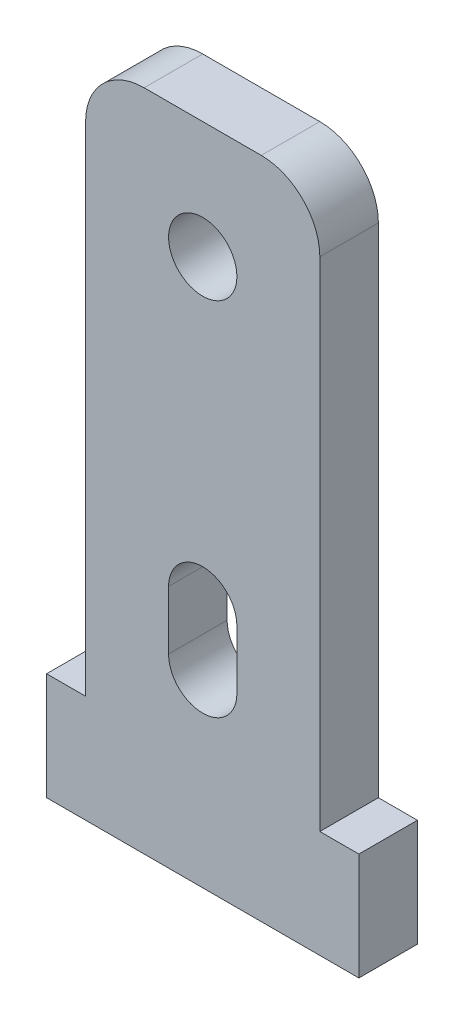
ISO-10303-21;
HEADER;
FILE_DESCRIPTION(('STEP AP214'),'2;1');
FILE_NAME('part.step','',(''),(''),'','','');
FILE_SCHEMA(('AUTOMOTIVE_DESIGN { 1 0 10303 214 1 1 1 1 }'));
ENDSEC;
DATA;
#1=APPLICATION_CONTEXT('core data for automotive mechanical design processes');
#2=APPLICATION_PROTOCOL_DEFINITION('international standard','automotive_design',2000,#1);
#3=PRODUCT_CONTEXT('',#1,'mechanical');
#4=PRODUCT('Part','Part','',(#3));
#5=PRODUCT_RELATED_PRODUCT_CATEGORY('part','',(#4));
#6=PRODUCT_DEFINITION_FORMATION('','',#4);
#7=PRODUCT_DEFINITION_CONTEXT('part definition',#1,'design');
#8=PRODUCT_DEFINITION('design','',#6,#7);
#9=PRODUCT_DEFINITION_SHAPE('','',#8);
#10=(LENGTH_UNIT() NAMED_UNIT(*) SI_UNIT(.MILLI.,.METRE.));
#11=(NAMED_UNIT(*) PLANE_ANGLE_UNIT() SI_UNIT($,.RADIAN.));
#12=(NAMED_UNIT(*) SI_UNIT($,.STERADIAN.) SOLID_ANGLE_UNIT());
#13=UNCERTAINTY_MEASURE_WITH_UNIT(LENGTH_MEASURE(1.E-05),#10,'distance_accuracy_value','');
#14=(GEOMETRIC_REPRESENTATION_CONTEXT(3) GLOBAL_UNCERTAINTY_ASSIGNED_CONTEXT((#13)) GLOBAL_UNIT_ASSIGNED_CONTEXT((#10,
#11,#12)) REPRESENTATION_CONTEXT('',''));
#15=CARTESIAN_POINT('',(0.,0.,0.));
#16=DIRECTION('',(0.,0.,1.));
#17=DIRECTION('',(1.,0.,0.));
#18=AXIS2_PLACEMENT_3D('',#15,#16,#17);
#19=CARTESIAN_POINT('',(0.,18.5,3.));
#20=DIRECTION('',(0.,1.,0.));
#21=DIRECTION('',(0.,0.,1.));
#22=AXIS2_PLACEMENT_3D('',#19,#20,#21);
#23=PLANE('',#22);
#24=DIRECTION('',(1.,0.,0.));
#25=VECTOR('',#24,1.);
#26=CARTESIAN_POINT('',(0.,18.5,0.));
#27=LINE('',#26,#25);
#28=CARTESIAN_POINT('',(-3.,18.5,0.));
#29=VERTEX_POINT('',#28);
#30=CARTESIAN_POINT('',(3.,18.5,0.));
#31=VERTEX_POINT('',#30);
#32=EDGE_CURVE('E192',#29,#31,#27,.T.);
#33=ORIENTED_EDGE('',*,*,#32,.F.);
#34=DIRECTION('',(0.,0.,-1.));
#35=VECTOR('',#34,1.);
#36=CARTESIAN_POINT('',(-3.,18.5,3.));
#37=LINE('',#36,#35);
#38=CARTESIAN_POINT('',(-3.,18.5,3.));
#39=VERTEX_POINT('',#38);
#40=EDGE_CURVE('E11',#39,#29,#37,.T.);
#41=ORIENTED_EDGE('',*,*,#40,.F.);
#42=DIRECTION('',(1.,0.,0.));
#43=VECTOR('',#42,1.);
#44=CARTESIAN_POINT('',(0.,18.5,3.));
#45=LINE('',#44,#43);
#46=CARTESIAN_POINT('',(3.,18.5,3.));
#47=VERTEX_POINT('',#46);
#48=EDGE_CURVE('E259',#39,#47,#45,.T.);
#49=ORIENTED_EDGE('',*,*,#48,.T.);
#50=DIRECTION('',(0.,0.,-1.));
#51=VECTOR('',#50,1.);
#52=CARTESIAN_POINT('',(3.,18.5,3.));
#53=LINE('',#52,#51);
#54=EDGE_CURVE('E60',#47,#31,#53,.T.);
#55=ORIENTED_EDGE('',*,*,#54,.T.);
#56=EDGE_LOOP('',(#33,#41,#49,#55));
#57=FACE_BOUND('',#56,.T.);
#58=ADVANCED_FACE('F41',(#57),#23,.T.);
#59=CARTESIAN_POINT('',(-3.,15.5,3.));
#60=DIRECTION('',(0.,0.,-1.));
#61=DIRECTION('',(-1.,0.,0.));
#62=AXIS2_PLACEMENT_3D('',#59,#60,#61);
#63=CYLINDRICAL_SURFACE('',#62,3.);
#64=CARTESIAN_POINT('',(-3.,15.5,0.));
#65=DIRECTION('',(0.,0.,1.));
#66=DIRECTION('',(1.,0.,0.));
#67=AXIS2_PLACEMENT_3D('',#64,#65,#66);
#68=CIRCLE('',#67,3.);
#69=CARTESIAN_POINT('',(-6.,15.5,0.));
#70=VERTEX_POINT('',#69);
#71=EDGE_CURVE('E194',#29,#70,#68,.T.);
#72=ORIENTED_EDGE('',*,*,#71,.T.);
#73=DIRECTION('',(0.,0.,-1.));
#74=VECTOR('',#73,1.);
#75=CARTESIAN_POINT('',(-6.,15.5,3.));
#76=LINE('',#75,#74);
#77=CARTESIAN_POINT('',(-6.,15.5,3.));
#78=VERTEX_POINT('',#77);
#79=EDGE_CURVE('E51',#78,#70,#76,.T.);
#80=ORIENTED_EDGE('',*,*,#79,.F.);
#81=CARTESIAN_POINT('',(-3.,15.5,3.));
#82=DIRECTION('',(0.,0.,1.));
#83=DIRECTION('',(1.,0.,0.));
#84=AXIS2_PLACEMENT_3D('',#81,#82,#83);
#85=CIRCLE('',#84,3.);
#86=EDGE_CURVE('E267',#39,#78,#85,.T.);
#87=ORIENTED_EDGE('',*,*,#86,.F.);
#88=ORIENTED_EDGE('',*,*,#40,.T.);
#89=EDGE_LOOP('',(#72,#80,#87,#88));
#90=FACE_BOUND('',#89,.T.);
#91=ADVANCED_FACE('F297',(#90),#63,.T.);
#92=CARTESIAN_POINT('',(-6.,0.,3.));
#93=DIRECTION('',(1.,0.,0.));
#94=DIRECTION('',(0.,1.,0.));
#95=AXIS2_PLACEMENT_3D('',#92,#93,#94);
#96=PLANE('',#95);
#97=DIRECTION('',(0.,-1.,0.));
#98=VECTOR('',#97,1.);
#99=CARTESIAN_POINT('',(-6.,0.,0.));
#100=LINE('',#99,#98);
#101=CARTESIAN_POINT('',(-5.99999999999999,-10.,0.));
#102=VERTEX_POINT('',#101);
#103=EDGE_CURVE('E197',#70,#102,#100,.T.);
#104=ORIENTED_EDGE('',*,*,#103,.T.);
#105=DIRECTION('',(0.,0.,-1.));
#106=VECTOR('',#105,1.);
#107=CARTESIAN_POINT('',(-5.99999999999999,-10.,3.));
#108=LINE('',#107,#106);
#109=CARTESIAN_POINT('',(-5.99999999999999,-10.,3.));
#110=VERTEX_POINT('',#109);
#111=EDGE_CURVE('E229',#110,#102,#108,.T.);
#112=ORIENTED_EDGE('',*,*,#111,.F.);
#113=DIRECTION('',(0.,-1.,0.));
#114=VECTOR('',#113,1.);
#115=CARTESIAN_POINT('',(-6.,0.,3.));
#116=LINE('',#115,#114);
#117=EDGE_CURVE('E270',#78,#110,#116,.T.);
#118=ORIENTED_EDGE('',*,*,#117,.F.);
#119=ORIENTED_EDGE('',*,*,#79,.T.);
#120=EDGE_LOOP('',(#104,#112,#118,#119));
#121=FACE_BOUND('',#120,.T.);
#122=ADVANCED_FACE('F302',(#121),#96,.F.);
#123=CARTESIAN_POINT('',(0.,-10.,3.));
#124=DIRECTION('',(0.,1.,0.));
#125=DIRECTION('',(-1.,0.,0.));
#126=AXIS2_PLACEMENT_3D('',#123,#124,#125);
#127=PLANE('',#126);
#128=DIRECTION('',(1.,0.,0.));
#129=VECTOR('',#128,1.);
#130=CARTESIAN_POINT('',(0.,-10.,0.));
#131=LINE('',#130,#129);
#132=CARTESIAN_POINT('',(-8.,-10.,0.));
#133=VERTEX_POINT('',#132);
#134=EDGE_CURVE('E200',#133,#102,#131,.T.);
#135=ORIENTED_EDGE('',*,*,#134,.F.);
#136=DIRECTION('',(0.,0.,-1.));
#137=VECTOR('',#136,1.);
#138=CARTESIAN_POINT('',(-8.,-10.,3.));
#139=LINE('',#138,#137);
#140=CARTESIAN_POINT('',(-8.,-10.,3.));
#141=VERTEX_POINT('',#140);
#142=EDGE_CURVE('E227',#141,#133,#139,.T.);
#143=ORIENTED_EDGE('',*,*,#142,.F.);
#144=DIRECTION('',(1.,0.,0.));
#145=VECTOR('',#144,1.);
#146=CARTESIAN_POINT('',(0.,-10.,3.));
#147=LINE('',#146,#145);
#148=EDGE_CURVE('E272',#141,#110,#147,.T.);
#149=ORIENTED_EDGE('',*,*,#148,.T.);
#150=ORIENTED_EDGE('',*,*,#111,.T.);
#151=EDGE_LOOP('',(#135,#143,#149,#150));
#152=FACE_BOUND('',#151,.T.);
#153=ADVANCED_FACE('F330',(#152),#127,.T.);
#154=CARTESIAN_POINT('',(-8.,0.,3.));
#155=DIRECTION('',(1.,0.,0.));
#156=DIRECTION('',(0.,0.,-1.));
#157=AXIS2_PLACEMENT_3D('',#154,#155,#156);
#158=PLANE('',#157);
#159=DIRECTION('',(0.,-1.,0.));
#160=VECTOR('',#159,1.);
#161=CARTESIAN_POINT('',(-8.,0.,0.));
#162=LINE('',#161,#160);
#163=CARTESIAN_POINT('',(-8.,-15.5,0.));
#164=VERTEX_POINT('',#163);
#165=EDGE_CURVE('E203',#133,#164,#162,.T.);
#166=ORIENTED_EDGE('',*,*,#165,.T.);
#167=DIRECTION('',(0.,0.,-1.));
#168=VECTOR('',#167,1.);
#169=CARTESIAN_POINT('',(-8.,-15.5,3.));
#170=LINE('',#169,#168);
#171=CARTESIAN_POINT('',(-8.,-15.5,3.));
#172=VERTEX_POINT('',#171);
#173=EDGE_CURVE('E224',#172,#164,#170,.T.);
#174=ORIENTED_EDGE('',*,*,#173,.F.);
#175=DIRECTION('',(0.,-1.,0.));
#176=VECTOR('',#175,1.);
#177=CARTESIAN_POINT('',(-8.,0.,3.));
#178=LINE('',#177,#176);
#179=EDGE_CURVE('E275',#141,#172,#178,.T.);
#180=ORIENTED_EDGE('',*,*,#179,.F.);
#181=ORIENTED_EDGE('',*,*,#142,.T.);
#182=EDGE_LOOP('',(#166,#174,#180,#181));
#183=FACE_BOUND('',#182,.T.);
#184=ADVANCED_FACE('F326',(#183),#158,.F.);
#185=CARTESIAN_POINT('',(0.,-15.5,3.));
#186=DIRECTION('',(0.,1.,0.));
#187=DIRECTION('',(-1.,0.,0.));
#188=AXIS2_PLACEMENT_3D('',#185,#186,#187);
#189=PLANE('',#188);
#190=DIRECTION('',(1.,0.,0.));
#191=VECTOR('',#190,1.);
#192=CARTESIAN_POINT('',(0.,-15.5,0.));
#193=LINE('',#192,#191);
#194=CARTESIAN_POINT('',(8.,-15.5,0.));
#195=VERTEX_POINT('',#194);
#196=EDGE_CURVE('E206',#164,#195,#193,.T.);
#197=ORIENTED_EDGE('',*,*,#196,.T.);
#198=DIRECTION('',(0.,0.,-1.));
#199=VECTOR('',#198,1.);
#200=CARTESIAN_POINT('',(8.,-15.5,3.));
#201=LINE('',#200,#199);
#202=CARTESIAN_POINT('',(8.,-15.5,3.));
#203=VERTEX_POINT('',#202);
#204=EDGE_CURVE('E222',#203,#195,#201,.T.);
#205=ORIENTED_EDGE('',*,*,#204,.F.);
#206=DIRECTION('',(1.,0.,0.));
#207=VECTOR('',#206,1.);
#208=CARTESIAN_POINT('',(0.,-15.5,3.));
#209=LINE('',#208,#207);
#210=EDGE_CURVE('E278',#172,#203,#209,.T.);
#211=ORIENTED_EDGE('',*,*,#210,.F.);
#212=ORIENTED_EDGE('',*,*,#173,.T.);
#213=EDGE_LOOP('',(#197,#205,#211,#212));
#214=FACE_BOUND('',#213,.T.);
#215=ADVANCED_FACE('F323',(#214),#189,.F.);
#216=CARTESIAN_POINT('',(7.99999999999999,0.,3.));
#217=DIRECTION('',(1.,0.,0.));
#218=DIRECTION('',(0.,1.,0.));
#219=AXIS2_PLACEMENT_3D('',#216,#217,#218);
#220=PLANE('',#219);
#221=DIRECTION('',(0.,-1.,0.));
#222=VECTOR('',#221,1.);
#223=CARTESIAN_POINT('',(7.99999999999999,0.,0.));
#224=LINE('',#223,#222);
#225=CARTESIAN_POINT('',(8.,-10.,0.));
#226=VERTEX_POINT('',#225);
#227=EDGE_CURVE('E209',#226,#195,#224,.T.);
#228=ORIENTED_EDGE('',*,*,#227,.F.);
#229=DIRECTION('',(0.,0.,-1.));
#230=VECTOR('',#229,1.);
#231=CARTESIAN_POINT('',(8.,-10.,3.));
#232=LINE('',#231,#230);
#233=CARTESIAN_POINT('',(8.,-10.,3.));
#234=VERTEX_POINT('',#233);
#235=EDGE_CURVE('E158',#234,#226,#232,.T.);
#236=ORIENTED_EDGE('',*,*,#235,.F.);
#237=DIRECTION('',(0.,-1.,0.));
#238=VECTOR('',#237,1.);
#239=CARTESIAN_POINT('',(7.99999999999999,0.,3.));
#240=LINE('',#239,#238);
#241=EDGE_CURVE('E168',#234,#203,#240,.T.);
#242=ORIENTED_EDGE('',*,*,#241,.T.);
#243=ORIENTED_EDGE('',*,*,#204,.T.);
#244=EDGE_LOOP('',(#228,#236,#242,#243));
#245=FACE_BOUND('',#244,.T.);
#246=ADVANCED_FACE('F281',(#245),#220,.T.);
#247=CARTESIAN_POINT('',(0.,-10.,3.));
#248=DIRECTION('',(0.,1.,0.));
#249=DIRECTION('',(-1.,0.,0.));
#250=AXIS2_PLACEMENT_3D('',#247,#248,#249);
#251=PLANE('',#250);
#252=DIRECTION('',(1.,0.,0.));
#253=VECTOR('',#252,1.);
#254=CARTESIAN_POINT('',(0.,-10.,0.));
#255=LINE('',#254,#253);
#256=CARTESIAN_POINT('',(6.,-10.,0.));
#257=VERTEX_POINT('',#256);
#258=EDGE_CURVE('E154',#257,#226,#255,.T.);
#259=ORIENTED_EDGE('',*,*,#258,.F.);
#260=DIRECTION('',(0.,0.,-1.));
#261=VECTOR('',#260,1.);
#262=CARTESIAN_POINT('',(6.,-10.,3.));
#263=LINE('',#262,#261);
#264=CARTESIAN_POINT('',(6.,-10.,3.));
#265=VERTEX_POINT('',#264);
#266=EDGE_CURVE('E149',#265,#257,#263,.T.);
#267=ORIENTED_EDGE('',*,*,#266,.F.);
#268=DIRECTION('',(1.,0.,0.));
#269=VECTOR('',#268,1.);
#270=CARTESIAN_POINT('',(0.,-10.,3.));
#271=LINE('',#270,#269);
#272=EDGE_CURVE('E152',#265,#234,#271,.T.);
#273=ORIENTED_EDGE('',*,*,#272,.T.);
#274=ORIENTED_EDGE('',*,*,#235,.T.);
#275=EDGE_LOOP('',(#259,#267,#273,#274));
#276=FACE_BOUND('',#275,.T.);
#277=ADVANCED_FACE('F151',(#276),#251,.T.);
#278=CARTESIAN_POINT('',(6.,0.,3.));
#279=DIRECTION('',(1.,0.,0.));
#280=DIRECTION('',(0.,0.,-1.));
#281=AXIS2_PLACEMENT_3D('',#278,#279,#280);
#282=PLANE('',#281);
#283=DIRECTION('',(0.,-1.,0.));
#284=VECTOR('',#283,1.);
#285=CARTESIAN_POINT('',(6.,0.,0.));
#286=LINE('',#285,#284);
#287=CARTESIAN_POINT('',(6.,15.5,0.));
#288=VERTEX_POINT('',#287);
#289=EDGE_CURVE('E213',#288,#257,#286,.T.);
#290=ORIENTED_EDGE('',*,*,#289,.F.);
#291=DIRECTION('',(0.,0.,-1.));
#292=VECTOR('',#291,1.);
#293=CARTESIAN_POINT('',(6.,15.5,3.));
#294=LINE('',#293,#292);
#295=CARTESIAN_POINT('',(6.,15.5,3.));
#296=VERTEX_POINT('',#295);
#297=EDGE_CURVE('E103',#296,#288,#294,.T.);
#298=ORIENTED_EDGE('',*,*,#297,.F.);
#299=DIRECTION('',(0.,-1.,0.));
#300=VECTOR('',#299,1.);
#301=CARTESIAN_POINT('',(6.,0.,3.));
#302=LINE('',#301,#300);
#303=EDGE_CURVE('E166',#296,#265,#302,.T.);
#304=ORIENTED_EDGE('',*,*,#303,.T.);
#305=ORIENTED_EDGE('',*,*,#266,.T.);
#306=EDGE_LOOP('',(#290,#298,#304,#305));
#307=FACE_BOUND('',#306,.T.);
#308=ADVANCED_FACE('F170',(#307),#282,.T.);
#309=CARTESIAN_POINT('',(0.,-6.,3.));
#310=DIRECTION('',(0.,0.,-1.));
#311=DIRECTION('',(-1.,0.,0.));
#312=AXIS2_PLACEMENT_3D('',#309,#310,#311);
#313=CYLINDRICAL_SURFACE('',#312,1.75);
#314=CARTESIAN_POINT('',(0.,-6.,0.));
#315=DIRECTION('',(0.,0.,1.));
#316=DIRECTION('',(1.,0.,0.));
#317=AXIS2_PLACEMENT_3D('',#314,#315,#316);
#318=CIRCLE('',#317,1.75);
#319=CARTESIAN_POINT('',(-1.75,-6.,0.));
#320=VERTEX_POINT('',#319);
#321=CARTESIAN_POINT('',(1.75,-6.,0.));
#322=VERTEX_POINT('',#321);
#323=EDGE_CURVE('E180',#320,#322,#318,.T.);
#324=ORIENTED_EDGE('',*,*,#323,.F.);
#325=DIRECTION('',(0.,0.,-1.));
#326=VECTOR('',#325,1.);
#327=CARTESIAN_POINT('',(-1.75,-6.,3.));
#328=LINE('',#327,#326);
#329=CARTESIAN_POINT('',(-1.75,-6.,3.));
#330=VERTEX_POINT('',#329);
#331=EDGE_CURVE('E45',#330,#320,#328,.T.);
#332=ORIENTED_EDGE('',*,*,#331,.F.);
#333=CARTESIAN_POINT('',(0.,-6.,3.));
#334=DIRECTION('',(0.,0.,1.));
#335=DIRECTION('',(1.,0.,0.));
#336=AXIS2_PLACEMENT_3D('',#333,#334,#335);
#337=CIRCLE('',#336,1.75);
#338=CARTESIAN_POINT('',(1.75,-6.,3.));
#339=VERTEX_POINT('',#338);
#340=EDGE_CURVE('E262',#330,#339,#337,.T.);
#341=ORIENTED_EDGE('',*,*,#340,.T.);
#342=DIRECTION('',(0.,0.,-1.));
#343=VECTOR('',#342,1.);
#344=CARTESIAN_POINT('',(1.75,-6.,3.));
#345=LINE('',#344,#343);
#346=EDGE_CURVE('E173',#339,#322,#345,.T.);
#347=ORIENTED_EDGE('',*,*,#346,.T.);
#348=EDGE_LOOP('',(#324,#332,#341,#347));
#349=FACE_BOUND('',#348,.T.);
#350=ADVANCED_FACE('F245',(#349),#313,.F.);
#351=CARTESIAN_POINT('',(-1.75,0.,3.));
#352=DIRECTION('',(1.,0.,0.));
#353=DIRECTION('',(0.,1.,0.));
#354=AXIS2_PLACEMENT_3D('',#351,#352,#353);
#355=PLANE('',#354);
#356=DIRECTION('',(0.,-1.,0.));
#357=VECTOR('',#356,1.);
#358=CARTESIAN_POINT('',(-1.75,0.,0.));
#359=LINE('',#358,#357);
#360=CARTESIAN_POINT('',(-1.75,-3.,0.));
#361=VERTEX_POINT('',#360);
#362=EDGE_CURVE('E183',#361,#320,#359,.T.);
#363=ORIENTED_EDGE('',*,*,#362,.F.);
#364=DIRECTION('',(0.,0.,-1.));
#365=VECTOR('',#364,1.);
#366=CARTESIAN_POINT('',(-1.75,-3.,3.));
#367=LINE('',#366,#365);
#368=CARTESIAN_POINT('',(-1.75,-3.,3.));
#369=VERTEX_POINT('',#368);
#370=EDGE_CURVE('E235',#369,#361,#367,.T.);
#371=ORIENTED_EDGE('',*,*,#370,.F.);
#372=DIRECTION('',(0.,-1.,0.));
#373=VECTOR('',#372,1.);
#374=CARTESIAN_POINT('',(-1.75,0.,3.));
#375=LINE('',#374,#373);
#376=EDGE_CURVE('E244',#369,#330,#375,.T.);
#377=ORIENTED_EDGE('',*,*,#376,.T.);
#378=ORIENTED_EDGE('',*,*,#331,.T.);
#379=EDGE_LOOP('',(#363,#371,#377,#378));
#380=FACE_BOUND('',#379,.T.);
#381=ADVANCED_FACE('F242',(#380),#355,.T.);
#382=CARTESIAN_POINT('',(0.,-3.,3.));
#383=DIRECTION('',(0.,0.,-1.));
#384=DIRECTION('',(-1.,0.,0.));
#385=AXIS2_PLACEMENT_3D('',#382,#383,#384);
#386=CYLINDRICAL_SURFACE('',#385,1.75);
#387=CARTESIAN_POINT('',(0.,-3.,0.));
#388=DIRECTION('',(0.,0.,1.));
#389=DIRECTION('',(1.,0.,0.));
#390=AXIS2_PLACEMENT_3D('',#387,#388,#389);
#391=CIRCLE('',#390,1.75);
#392=CARTESIAN_POINT('',(1.75,-3.,0.));
#393=VERTEX_POINT('',#392);
#394=EDGE_CURVE('E186',#393,#361,#391,.T.);
#395=ORIENTED_EDGE('',*,*,#394,.F.);
#396=DIRECTION('',(0.,0.,-1.));
#397=VECTOR('',#396,1.);
#398=CARTESIAN_POINT('',(1.75,-3.,3.));
#399=LINE('',#398,#397);
#400=CARTESIAN_POINT('',(1.75,-3.,3.));
#401=VERTEX_POINT('',#400);
#402=EDGE_CURVE('E234',#401,#393,#399,.T.);
#403=ORIENTED_EDGE('',*,*,#402,.F.);
#404=CARTESIAN_POINT('',(0.,-3.,3.));
#405=DIRECTION('',(0.,0.,1.));
#406=DIRECTION('',(1.,0.,0.));
#407=AXIS2_PLACEMENT_3D('',#404,#405,#406);
#408=CIRCLE('',#407,1.75);
#409=EDGE_CURVE('E254',#401,#369,#408,.T.);
#410=ORIENTED_EDGE('',*,*,#409,.T.);
#411=ORIENTED_EDGE('',*,*,#370,.T.);
#412=EDGE_LOOP('',(#395,#403,#410,#411));
#413=FACE_BOUND('',#412,.T.);
#414=ADVANCED_FACE('F251',(#413),#386,.F.);
#415=CARTESIAN_POINT('',(1.75,0.,3.));
#416=DIRECTION('',(1.,0.,0.));
#417=DIRECTION('',(0.,0.,-1.));
#418=AXIS2_PLACEMENT_3D('',#415,#416,#417);
#419=PLANE('',#418);
#420=DIRECTION('',(0.,-1.,0.));
#421=VECTOR('',#420,1.);
#422=CARTESIAN_POINT('',(1.75,0.,0.));
#423=LINE('',#422,#421);
#424=EDGE_CURVE('E189',#393,#322,#423,.T.);
#425=ORIENTED_EDGE('',*,*,#424,.T.);
#426=ORIENTED_EDGE('',*,*,#346,.F.);
#427=DIRECTION('',(0.,-1.,0.));
#428=VECTOR('',#427,1.);
#429=CARTESIAN_POINT('',(1.75,0.,3.));
#430=LINE('',#429,#428);
#431=EDGE_CURVE('E256',#401,#339,#430,.T.);
#432=ORIENTED_EDGE('',*,*,#431,.F.);
#433=ORIENTED_EDGE('',*,*,#402,.T.);
#434=EDGE_LOOP('',(#425,#426,#432,#433));
#435=FACE_BOUND('',#434,.T.);
#436=ADVANCED_FACE('F257',(#435),#419,.F.);
#437=CARTESIAN_POINT('',(0.,12.5,3.));
#438=DIRECTION('',(0.,0.,-1.));
#439=DIRECTION('',(-1.,0.,0.));
#440=AXIS2_PLACEMENT_3D('',#437,#438,#439);
#441=CYLINDRICAL_SURFACE('',#440,1.75);
#442=CARTESIAN_POINT('',(0.,12.5,3.));
#443=DIRECTION('',(0.,0.,1.));
#444=DIRECTION('',(1.,0.,0.));
#445=AXIS2_PLACEMENT_3D('',#442,#443,#444);
#446=CIRCLE('',#445,1.75);
#447=CARTESIAN_POINT('',(1.75,12.5,3.));
#448=VERTEX_POINT('',#447);
#449=EDGE_CURVE('E218',#448,#448,#446,.T.);
#450=ORIENTED_EDGE('',*,*,#449,.T.);
#451=EDGE_LOOP('',(#450));
#452=FACE_BOUND('',#451,.T.);
#453=CARTESIAN_POINT('',(0.,12.5,0.));
#454=DIRECTION('',(0.,0.,1.));
#455=DIRECTION('',(1.,0.,0.));
#456=AXIS2_PLACEMENT_3D('',#453,#454,#455);
#457=CIRCLE('',#456,1.75);
#458=CARTESIAN_POINT('',(1.75,12.5,0.));
#459=VERTEX_POINT('',#458);
#460=EDGE_CURVE('E177',#459,#459,#457,.T.);
#461=ORIENTED_EDGE('',*,*,#460,.F.);
#462=EDGE_LOOP('',(#461));
#463=FACE_BOUND('',#462,.T.);
#464=ADVANCED_FACE('F43',(#452,#463),#441,.F.);
#465=CARTESIAN_POINT('',(3.,15.5,3.));
#466=DIRECTION('',(0.,0.,-1.));
#467=DIRECTION('',(-1.,0.,0.));
#468=AXIS2_PLACEMENT_3D('',#465,#466,#467);
#469=CYLINDRICAL_SURFACE('',#468,3.);
#470=CARTESIAN_POINT('',(3.,15.5,0.));
#471=DIRECTION('',(0.,0.,1.));
#472=DIRECTION('',(1.,0.,0.));
#473=AXIS2_PLACEMENT_3D('',#470,#471,#472);
#474=CIRCLE('',#473,3.);
#475=EDGE_CURVE('E215',#31,#288,#474,.F.);
#476=ORIENTED_EDGE('',*,*,#475,.F.);
#477=ORIENTED_EDGE('',*,*,#54,.F.);
#478=CARTESIAN_POINT('',(3.,15.5,3.));
#479=DIRECTION('',(0.,0.,1.));
#480=DIRECTION('',(1.,0.,0.));
#481=AXIS2_PLACEMENT_3D('',#478,#479,#480);
#482=CIRCLE('',#481,3.);
#483=EDGE_CURVE('E171',#47,#296,#482,.F.);
#484=ORIENTED_EDGE('',*,*,#483,.T.);
#485=ORIENTED_EDGE('',*,*,#297,.T.);
#486=EDGE_LOOP('',(#476,#477,#484,#485));
#487=FACE_BOUND('',#486,.T.);
#488=ADVANCED_FACE('F284',(#487),#469,.T.);
#489=CARTESIAN_POINT('',(0.,0.,3.));
#490=DIRECTION('',(0.,0.,1.));
#491=DIRECTION('',(1.,0.,0.));
#492=AXIS2_PLACEMENT_3D('',#489,#490,#491);
#493=PLANE('',#492);
#494=ORIENTED_EDGE('',*,*,#449,.F.);
#495=EDGE_LOOP('',(#494));
#496=FACE_BOUND('',#495,.T.);
#497=ORIENTED_EDGE('',*,*,#340,.F.);
#498=ORIENTED_EDGE('',*,*,#376,.F.);
#499=ORIENTED_EDGE('',*,*,#409,.F.);
#500=ORIENTED_EDGE('',*,*,#431,.T.);
#501=EDGE_LOOP('',(#497,#498,#499,#500));
#502=FACE_BOUND('',#501,.T.);
#503=ORIENTED_EDGE('',*,*,#48,.F.);
#504=ORIENTED_EDGE('',*,*,#86,.T.);
#505=ORIENTED_EDGE('',*,*,#117,.T.);
#506=ORIENTED_EDGE('',*,*,#148,.F.);
#507=ORIENTED_EDGE('',*,*,#179,.T.);
#508=ORIENTED_EDGE('',*,*,#210,.T.);
#509=ORIENTED_EDGE('',*,*,#241,.F.);
#510=ORIENTED_EDGE('',*,*,#272,.F.);
#511=ORIENTED_EDGE('',*,*,#303,.F.);
#512=ORIENTED_EDGE('',*,*,#483,.F.);
#513=EDGE_LOOP('',(#503,#504,#505,#506,#507,#508,#509,#510,#511,#512));
#514=FACE_BOUND('',#513,.T.);
#515=ADVANCED_FACE('F164',(#496,#502,#514),#493,.T.);
#516=CARTESIAN_POINT('',(0.,0.,0.));
#517=DIRECTION('',(0.,0.,1.));
#518=DIRECTION('',(1.,0.,0.));
#519=AXIS2_PLACEMENT_3D('',#516,#517,#518);
#520=PLANE('',#519);
#521=ORIENTED_EDGE('',*,*,#460,.T.);
#522=EDGE_LOOP('',(#521));
#523=FACE_BOUND('',#522,.T.);
#524=ORIENTED_EDGE('',*,*,#323,.T.);
#525=ORIENTED_EDGE('',*,*,#424,.F.);
#526=ORIENTED_EDGE('',*,*,#394,.T.);
#527=ORIENTED_EDGE('',*,*,#362,.T.);
#528=EDGE_LOOP('',(#524,#525,#526,#527));
#529=FACE_BOUND('',#528,.T.);
#530=ORIENTED_EDGE('',*,*,#32,.T.);
#531=ORIENTED_EDGE('',*,*,#475,.T.);
#532=ORIENTED_EDGE('',*,*,#289,.T.);
#533=ORIENTED_EDGE('',*,*,#258,.T.);
#534=ORIENTED_EDGE('',*,*,#227,.T.);
#535=ORIENTED_EDGE('',*,*,#196,.F.);
#536=ORIENTED_EDGE('',*,*,#165,.F.);
#537=ORIENTED_EDGE('',*,*,#134,.T.);
#538=ORIENTED_EDGE('',*,*,#103,.F.);
#539=ORIENTED_EDGE('',*,*,#71,.F.);
#540=EDGE_LOOP('',(#530,#531,#532,#533,#534,#535,#536,#537,#538,#539));
#541=FACE_BOUND('',#540,.T.);
#542=ADVANCED_FACE('F249',(#523,#529,#541),#520,.F.);
#543=CLOSED_SHELL('',(#58,#91,#122,#153,#184,#215,#246,#277,#308,#350,#381,#414,#436,#464,#488,
#515,#542));
#544=MANIFOLD_SOLID_BREP('B2',#543);
#545=ADVANCED_BREP_SHAPE_REPRESENTATION('',(#18,#544),#14);
#546=SHAPE_DEFINITION_REPRESENTATION(#9,#545);
ENDSEC;
END-ISO-10303-21;
